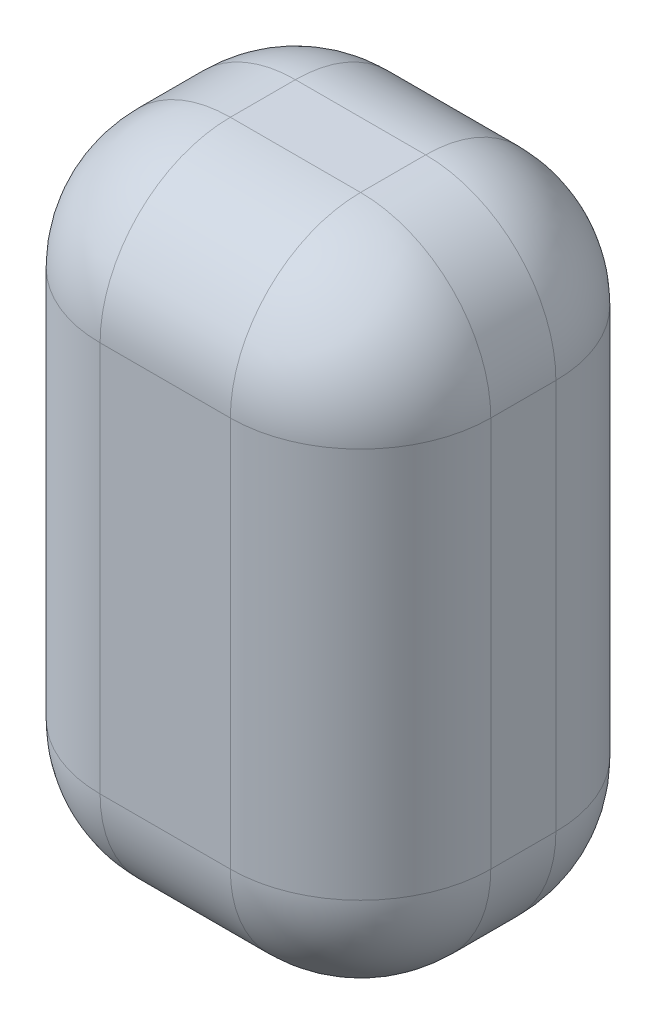
ISO-10303-21;
HEADER;
FILE_DESCRIPTION(('STEP AP214'),'2;1');
FILE_NAME('part.step','',(''),(''),'','','');
FILE_SCHEMA(('AUTOMOTIVE_DESIGN { 1 0 10303 214 1 1 1 1 }'));
ENDSEC;
DATA;
#1=APPLICATION_CONTEXT('core data for automotive mechanical design processes');
#2=APPLICATION_PROTOCOL_DEFINITION('international standard','automotive_design',2000,#1);
#3=PRODUCT_CONTEXT('',#1,'mechanical');
#4=PRODUCT('Part','Part','',(#3));
#5=PRODUCT_RELATED_PRODUCT_CATEGORY('part','',(#4));
#6=PRODUCT_DEFINITION_FORMATION('','',#4);
#7=PRODUCT_DEFINITION_CONTEXT('part definition',#1,'design');
#8=PRODUCT_DEFINITION('design','',#6,#7);
#9=PRODUCT_DEFINITION_SHAPE('','',#8);
#10=(LENGTH_UNIT() NAMED_UNIT(*) SI_UNIT(.MILLI.,.METRE.));
#11=(NAMED_UNIT(*) PLANE_ANGLE_UNIT() SI_UNIT($,.RADIAN.));
#12=(NAMED_UNIT(*) SI_UNIT($,.STERADIAN.) SOLID_ANGLE_UNIT());
#13=UNCERTAINTY_MEASURE_WITH_UNIT(LENGTH_MEASURE(1.E-05),#10,'distance_accuracy_value','');
#14=(GEOMETRIC_REPRESENTATION_CONTEXT(3) GLOBAL_UNCERTAINTY_ASSIGNED_CONTEXT((#13)) GLOBAL_UNIT_ASSIGNED_CONTEXT((#10,
#11,#12)) REPRESENTATION_CONTEXT('',''));
#15=CARTESIAN_POINT('',(0.,0.,0.));
#16=DIRECTION('',(0.,0.,1.));
#17=DIRECTION('',(1.,0.,0.));
#18=AXIS2_PLACEMENT_3D('',#15,#16,#17);
#19=CARTESIAN_POINT('',(30.,100.,-25.));
#20=DIRECTION('',(-1.,0.,0.));
#21=DIRECTION('',(0.,0.,1.));
#22=AXIS2_PLACEMENT_3D('',#19,#20,#21);
#23=PLANE('',#22);
#24=DIRECTION('',(0.,0.,-1.));
#25=VECTOR('',#24,1.);
#26=CARTESIAN_POINT('',(30.,80.,25.));
#27=LINE('',#26,#25);
#28=CARTESIAN_POINT('',(30.,80.,-5.00000000000001));
#29=VERTEX_POINT('',#28);
#30=CARTESIAN_POINT('',(30.,80.,4.99999999999999));
#31=VERTEX_POINT('',#30);
#32=EDGE_CURVE('E189',#29,#31,#27,.F.);
#33=ORIENTED_EDGE('',*,*,#32,.T.);
#34=DIRECTION('',(0.,-1.,0.));
#35=VECTOR('',#34,1.);
#36=CARTESIAN_POINT('',(30.,100.,4.99999999999999));
#37=LINE('',#36,#35);
#38=CARTESIAN_POINT('',(30.,20.,4.99999999999999));
#39=VERTEX_POINT('',#38);
#40=EDGE_CURVE('E191',#31,#39,#37,.T.);
#41=ORIENTED_EDGE('',*,*,#40,.T.);
#42=DIRECTION('',(0.,0.,-1.));
#43=VECTOR('',#42,1.);
#44=CARTESIAN_POINT('',(30.,20.,-25.));
#45=LINE('',#44,#43);
#46=CARTESIAN_POINT('',(30.,20.,-5.00000000000001));
#47=VERTEX_POINT('',#46);
#48=EDGE_CURVE('E187',#39,#47,#45,.T.);
#49=ORIENTED_EDGE('',*,*,#48,.T.);
#50=DIRECTION('',(0.,-1.,0.));
#51=VECTOR('',#50,1.);
#52=CARTESIAN_POINT('',(30.,100.,-5.00000000000001));
#53=LINE('',#52,#51);
#54=EDGE_CURVE('E185',#47,#29,#53,.F.);
#55=ORIENTED_EDGE('',*,*,#54,.T.);
#56=EDGE_LOOP('',(#33,#41,#49,#55));
#57=FACE_BOUND('',#56,.T.);
#58=ADVANCED_FACE('F33',(#57),#23,.F.);
#59=CARTESIAN_POINT('',(-30.,100.,-25.));
#60=DIRECTION('',(0.,0.,1.));
#61=DIRECTION('',(1.,0.,0.));
#62=AXIS2_PLACEMENT_3D('',#59,#60,#61);
#63=PLANE('',#62);
#64=DIRECTION('',(-1.,0.,0.));
#65=VECTOR('',#64,1.);
#66=CARTESIAN_POINT('',(30.,80.,-25.));
#67=LINE('',#66,#65);
#68=CARTESIAN_POINT('',(-10.,80.,-25.));
#69=VERTEX_POINT('',#68);
#70=CARTESIAN_POINT('',(9.99999999999999,80.,-25.));
#71=VERTEX_POINT('',#70);
#72=EDGE_CURVE('E42',#69,#71,#67,.F.);
#73=ORIENTED_EDGE('',*,*,#72,.T.);
#74=DIRECTION('',(0.,-1.,0.));
#75=VECTOR('',#74,1.);
#76=CARTESIAN_POINT('',(9.99999999999999,100.,-25.));
#77=LINE('',#76,#75);
#78=CARTESIAN_POINT('',(9.99999999999999,20.,-25.));
#79=VERTEX_POINT('',#78);
#80=EDGE_CURVE('E11',#71,#79,#77,.T.);
#81=ORIENTED_EDGE('',*,*,#80,.T.);
#82=DIRECTION('',(-1.,0.,0.));
#83=VECTOR('',#82,1.);
#84=CARTESIAN_POINT('',(-30.,20.,-25.));
#85=LINE('',#84,#83);
#86=CARTESIAN_POINT('',(-10.,20.,-25.));
#87=VERTEX_POINT('',#86);
#88=EDGE_CURVE('E194',#79,#87,#85,.T.);
#89=ORIENTED_EDGE('',*,*,#88,.T.);
#90=DIRECTION('',(0.,-1.,0.));
#91=VECTOR('',#90,1.);
#92=CARTESIAN_POINT('',(-10.,100.,-25.));
#93=LINE('',#92,#91);
#94=EDGE_CURVE('E53',#87,#69,#93,.F.);
#95=ORIENTED_EDGE('',*,*,#94,.T.);
#96=EDGE_LOOP('',(#73,#81,#89,#95));
#97=FACE_BOUND('',#96,.T.);
#98=ADVANCED_FACE('F317',(#97),#63,.F.);
#99=CARTESIAN_POINT('',(-30.,100.,-25.));
#100=DIRECTION('',(1.,0.,0.));
#101=DIRECTION('',(0.,0.,-1.));
#102=AXIS2_PLACEMENT_3D('',#99,#100,#101);
#103=PLANE('',#102);
#104=DIRECTION('',(0.,-1.,0.));
#105=VECTOR('',#104,1.);
#106=CARTESIAN_POINT('',(-30.,100.,5.));
#107=LINE('',#106,#105);
#108=CARTESIAN_POINT('',(-30.,20.,5.));
#109=VERTEX_POINT('',#108);
#110=CARTESIAN_POINT('',(-30.,80.,5.));
#111=VERTEX_POINT('',#110);
#112=EDGE_CURVE('E180',#109,#111,#107,.F.);
#113=ORIENTED_EDGE('',*,*,#112,.T.);
#114=DIRECTION('',(0.,0.,1.));
#115=VECTOR('',#114,1.);
#116=CARTESIAN_POINT('',(-30.,80.,-25.));
#117=LINE('',#116,#115);
#118=CARTESIAN_POINT('',(-30.,80.,-5.));
#119=VERTEX_POINT('',#118);
#120=EDGE_CURVE('E182',#111,#119,#117,.F.);
#121=ORIENTED_EDGE('',*,*,#120,.T.);
#122=DIRECTION('',(0.,-1.,0.));
#123=VECTOR('',#122,1.);
#124=CARTESIAN_POINT('',(-30.,100.,-5.));
#125=LINE('',#124,#123);
#126=CARTESIAN_POINT('',(-30.,20.,-5.));
#127=VERTEX_POINT('',#126);
#128=EDGE_CURVE('E176',#119,#127,#125,.T.);
#129=ORIENTED_EDGE('',*,*,#128,.T.);
#130=DIRECTION('',(0.,0.,1.));
#131=VECTOR('',#130,1.);
#132=CARTESIAN_POINT('',(-30.,20.,-25.));
#133=LINE('',#132,#131);
#134=EDGE_CURVE('E178',#127,#109,#133,.T.);
#135=ORIENTED_EDGE('',*,*,#134,.T.);
#136=EDGE_LOOP('',(#113,#121,#129,#135));
#137=FACE_BOUND('',#136,.T.);
#138=ADVANCED_FACE('F268',(#137),#103,.F.);
#139=CARTESIAN_POINT('',(-30.,100.,25.));
#140=DIRECTION('',(0.,0.,-1.));
#141=DIRECTION('',(-1.,0.,0.));
#142=AXIS2_PLACEMENT_3D('',#139,#140,#141);
#143=PLANE('',#142);
#144=DIRECTION('',(1.,0.,0.));
#145=VECTOR('',#144,1.);
#146=CARTESIAN_POINT('',(-30.,80.,25.));
#147=LINE('',#146,#145);
#148=CARTESIAN_POINT('',(9.99999999999999,80.,25.));
#149=VERTEX_POINT('',#148);
#150=CARTESIAN_POINT('',(-10.,80.,25.));
#151=VERTEX_POINT('',#150);
#152=EDGE_CURVE('E150',#149,#151,#147,.F.);
#153=ORIENTED_EDGE('',*,*,#152,.T.);
#154=DIRECTION('',(0.,-1.,0.));
#155=VECTOR('',#154,1.);
#156=CARTESIAN_POINT('',(-10.,100.,25.));
#157=LINE('',#156,#155);
#158=CARTESIAN_POINT('',(-10.,20.,25.));
#159=VERTEX_POINT('',#158);
#160=EDGE_CURVE('E154',#151,#159,#157,.T.);
#161=ORIENTED_EDGE('',*,*,#160,.T.);
#162=DIRECTION('',(1.,0.,0.));
#163=VECTOR('',#162,1.);
#164=CARTESIAN_POINT('',(-30.,20.,25.));
#165=LINE('',#164,#163);
#166=CARTESIAN_POINT('',(9.99999999999999,20.,25.));
#167=VERTEX_POINT('',#166);
#168=EDGE_CURVE('E126',#159,#167,#165,.T.);
#169=ORIENTED_EDGE('',*,*,#168,.T.);
#170=DIRECTION('',(0.,-1.,0.));
#171=VECTOR('',#170,1.);
#172=CARTESIAN_POINT('',(9.99999999999999,100.,25.));
#173=LINE('',#172,#171);
#174=EDGE_CURVE('E144',#167,#149,#173,.F.);
#175=ORIENTED_EDGE('',*,*,#174,.T.);
#176=EDGE_LOOP('',(#153,#161,#169,#175));
#177=FACE_BOUND('',#176,.T.);
#178=ADVANCED_FACE('F152',(#177),#143,.F.);
#179=CARTESIAN_POINT('',(0.,100.,0.));
#180=DIRECTION('',(0.,1.,0.));
#181=DIRECTION('',(0.,0.,1.));
#182=AXIS2_PLACEMENT_3D('',#179,#180,#181);
#183=PLANE('',#182);
#184=DIRECTION('',(0.,0.,1.));
#185=VECTOR('',#184,1.);
#186=CARTESIAN_POINT('',(-10.,100.,25.));
#187=LINE('',#186,#185);
#188=CARTESIAN_POINT('',(-10.,100.,-5.));
#189=VERTEX_POINT('',#188);
#190=CARTESIAN_POINT('',(-10.,100.,5.));
#191=VERTEX_POINT('',#190);
#192=EDGE_CURVE('E171',#189,#191,#187,.T.);
#193=ORIENTED_EDGE('',*,*,#192,.T.);
#194=DIRECTION('',(1.,0.,0.));
#195=VECTOR('',#194,1.);
#196=CARTESIAN_POINT('',(30.,100.,5.));
#197=LINE('',#196,#195);
#198=CARTESIAN_POINT('',(9.99999999999999,100.,5.));
#199=VERTEX_POINT('',#198);
#200=EDGE_CURVE('E173',#191,#199,#197,.T.);
#201=ORIENTED_EDGE('',*,*,#200,.T.);
#202=DIRECTION('',(0.,0.,-1.));
#203=VECTOR('',#202,1.);
#204=CARTESIAN_POINT('',(9.99999999999999,100.,-25.));
#205=LINE('',#204,#203);
#206=CARTESIAN_POINT('',(9.99999999999999,100.,-5.));
#207=VERTEX_POINT('',#206);
#208=EDGE_CURVE('E169',#199,#207,#205,.T.);
#209=ORIENTED_EDGE('',*,*,#208,.T.);
#210=DIRECTION('',(-1.,0.,0.));
#211=VECTOR('',#210,1.);
#212=CARTESIAN_POINT('',(-30.,100.,-5.));
#213=LINE('',#212,#211);
#214=EDGE_CURVE('E167',#207,#189,#213,.T.);
#215=ORIENTED_EDGE('',*,*,#214,.T.);
#216=EDGE_LOOP('',(#193,#201,#209,#215));
#217=FACE_BOUND('',#216,.T.);
#218=ADVANCED_FACE('F310',(#217),#183,.T.);
#219=CARTESIAN_POINT('',(0.,0.,0.));
#220=DIRECTION('',(0.,1.,0.));
#221=DIRECTION('',(0.,0.,1.));
#222=AXIS2_PLACEMENT_3D('',#219,#220,#221);
#223=PLANE('',#222);
#224=DIRECTION('',(0.,0.,-1.));
#225=VECTOR('',#224,1.);
#226=CARTESIAN_POINT('',(9.99999999999999,0.,0.));
#227=LINE('',#226,#225);
#228=CARTESIAN_POINT('',(9.99999999999999,0.,-5.));
#229=VERTEX_POINT('',#228);
#230=CARTESIAN_POINT('',(9.99999999999999,0.,5.));
#231=VERTEX_POINT('',#230);
#232=EDGE_CURVE('E162',#229,#231,#227,.F.);
#233=ORIENTED_EDGE('',*,*,#232,.T.);
#234=DIRECTION('',(1.,0.,0.));
#235=VECTOR('',#234,1.);
#236=CARTESIAN_POINT('',(0.,0.,5.));
#237=LINE('',#236,#235);
#238=CARTESIAN_POINT('',(-10.,0.,5.));
#239=VERTEX_POINT('',#238);
#240=EDGE_CURVE('E128',#231,#239,#237,.F.);
#241=ORIENTED_EDGE('',*,*,#240,.T.);
#242=DIRECTION('',(0.,0.,1.));
#243=VECTOR('',#242,1.);
#244=CARTESIAN_POINT('',(-10.,0.,0.));
#245=LINE('',#244,#243);
#246=CARTESIAN_POINT('',(-10.,0.,-5.));
#247=VERTEX_POINT('',#246);
#248=EDGE_CURVE('E164',#239,#247,#245,.F.);
#249=ORIENTED_EDGE('',*,*,#248,.T.);
#250=DIRECTION('',(-1.,0.,0.));
#251=VECTOR('',#250,1.);
#252=CARTESIAN_POINT('',(0.,0.,-5.));
#253=LINE('',#252,#251);
#254=EDGE_CURVE('E157',#247,#229,#253,.F.);
#255=ORIENTED_EDGE('',*,*,#254,.T.);
#256=EDGE_LOOP('',(#233,#241,#249,#255));
#257=FACE_BOUND('',#256,.T.);
#258=ADVANCED_FACE('F290',(#257),#223,.F.);
#259=CARTESIAN_POINT('',(0.,80.,-5.));
#260=DIRECTION('',(1.,0.,0.));
#261=DIRECTION('',(0.,0.,-1.));
#262=AXIS2_PLACEMENT_3D('',#259,#260,#261);
#263=CYLINDRICAL_SURFACE('',#262,20.);
#264=CARTESIAN_POINT('',(-10.,80.,-5.));
#265=DIRECTION('',(-1.,0.,0.));
#266=DIRECTION('',(0.,0.,1.));
#267=AXIS2_PLACEMENT_3D('',#264,#265,#266);
#268=CIRCLE('',#267,20.);
#269=EDGE_CURVE('E37',#189,#69,#268,.T.);
#270=ORIENTED_EDGE('',*,*,#269,.F.);
#271=ORIENTED_EDGE('',*,*,#214,.F.);
#272=CARTESIAN_POINT('',(9.99999999999999,80.,-5.));
#273=DIRECTION('',(1.,0.,0.));
#274=DIRECTION('',(0.,1.,0.));
#275=AXIS2_PLACEMENT_3D('',#272,#273,#274);
#276=CIRCLE('',#275,20.);
#277=EDGE_CURVE('E248',#71,#207,#276,.T.);
#278=ORIENTED_EDGE('',*,*,#277,.F.);
#279=ORIENTED_EDGE('',*,*,#72,.F.);
#280=EDGE_LOOP('',(#270,#271,#278,#279));
#281=FACE_BOUND('',#280,.T.);
#282=ADVANCED_FACE('F35',(#281),#263,.T.);
#283=CARTESIAN_POINT('',(-10.,80.,-5.));
#284=DIRECTION('',(0.,0.,1.));
#285=DIRECTION('',(1.,0.,0.));
#286=AXIS2_PLACEMENT_3D('',#283,#284,#285);
#287=SPHERICAL_SURFACE('',#286,20.);
#288=CARTESIAN_POINT('',(-10.,80.,-5.));
#289=DIRECTION('',(0.,0.,-1.));
#290=DIRECTION('',(-1.,0.,0.));
#291=AXIS2_PLACEMENT_3D('',#288,#289,#290);
#292=CIRCLE('',#291,20.);
#293=EDGE_CURVE('E243',#189,#119,#292,.F.);
#294=ORIENTED_EDGE('',*,*,#293,.F.);
#295=ORIENTED_EDGE('',*,*,#269,.T.);
#296=CARTESIAN_POINT('',(-10.,80.,-5.));
#297=DIRECTION('',(0.,1.,0.));
#298=DIRECTION('',(0.,0.,1.));
#299=AXIS2_PLACEMENT_3D('',#296,#297,#298);
#300=CIRCLE('',#299,20.);
#301=EDGE_CURVE('E246',#119,#69,#300,.F.);
#302=ORIENTED_EDGE('',*,*,#301,.F.);
#303=EDGE_LOOP('',(#294,#295,#302));
#304=FACE_BOUND('',#303,.T.);
#305=ADVANCED_FACE('F258',(#304),#287,.T.);
#306=CARTESIAN_POINT('',(9.99999999999999,80.,-5.));
#307=DIRECTION('',(0.,0.,1.));
#308=DIRECTION('',(1.,0.,0.));
#309=AXIS2_PLACEMENT_3D('',#306,#307,#308);
#310=SPHERICAL_SURFACE('',#309,20.);
#311=CARTESIAN_POINT('',(9.99999999999999,80.,-5.));
#312=DIRECTION('',(0.,1.,0.));
#313=DIRECTION('',(0.,0.,1.));
#314=AXIS2_PLACEMENT_3D('',#311,#312,#313);
#315=CIRCLE('',#314,20.);
#316=EDGE_CURVE('E237',#71,#29,#315,.F.);
#317=ORIENTED_EDGE('',*,*,#316,.F.);
#318=ORIENTED_EDGE('',*,*,#277,.T.);
#319=CARTESIAN_POINT('',(9.99999999999999,80.,-5.));
#320=DIRECTION('',(0.,0.,-1.));
#321=DIRECTION('',(-1.,0.,0.));
#322=AXIS2_PLACEMENT_3D('',#319,#320,#321);
#323=CIRCLE('',#322,20.);
#324=EDGE_CURVE('E240',#29,#207,#323,.F.);
#325=ORIENTED_EDGE('',*,*,#324,.F.);
#326=EDGE_LOOP('',(#317,#318,#325));
#327=FACE_BOUND('',#326,.T.);
#328=ADVANCED_FACE('F312',(#327),#310,.T.);
#329=CARTESIAN_POINT('',(-10.,100.,-5.));
#330=DIRECTION('',(0.,-1.,0.));
#331=DIRECTION('',(0.,0.,-1.));
#332=AXIS2_PLACEMENT_3D('',#329,#330,#331);
#333=CYLINDRICAL_SURFACE('',#332,20.);
#334=ORIENTED_EDGE('',*,*,#301,.T.);
#335=ORIENTED_EDGE('',*,*,#94,.F.);
#336=CARTESIAN_POINT('',(-10.,20.,-5.));
#337=DIRECTION('',(0.,-1.,0.));
#338=DIRECTION('',(0.,0.,-1.));
#339=AXIS2_PLACEMENT_3D('',#336,#337,#338);
#340=CIRCLE('',#339,20.);
#341=EDGE_CURVE('E231',#127,#87,#340,.T.);
#342=ORIENTED_EDGE('',*,*,#341,.F.);
#343=ORIENTED_EDGE('',*,*,#128,.F.);
#344=EDGE_LOOP('',(#334,#335,#342,#343));
#345=FACE_BOUND('',#344,.T.);
#346=ADVANCED_FACE('F263',(#345),#333,.T.);
#347=CARTESIAN_POINT('',(-10.,80.,0.));
#348=DIRECTION('',(0.,0.,-1.));
#349=DIRECTION('',(-1.,0.,0.));
#350=AXIS2_PLACEMENT_3D('',#347,#348,#349);
#351=CYLINDRICAL_SURFACE('',#350,20.);
#352=ORIENTED_EDGE('',*,*,#293,.T.);
#353=ORIENTED_EDGE('',*,*,#120,.F.);
#354=CARTESIAN_POINT('',(-10.,80.,5.));
#355=DIRECTION('',(0.,0.,1.));
#356=DIRECTION('',(1.,0.,0.));
#357=AXIS2_PLACEMENT_3D('',#354,#355,#356);
#358=CIRCLE('',#357,20.);
#359=EDGE_CURVE('E228',#191,#111,#358,.T.);
#360=ORIENTED_EDGE('',*,*,#359,.F.);
#361=ORIENTED_EDGE('',*,*,#192,.F.);
#362=EDGE_LOOP('',(#352,#353,#360,#361));
#363=FACE_BOUND('',#362,.T.);
#364=ADVANCED_FACE('F274',(#363),#351,.T.);
#365=CARTESIAN_POINT('',(0.,80.,5.));
#366=DIRECTION('',(-1.,0.,0.));
#367=DIRECTION('',(0.,0.,1.));
#368=AXIS2_PLACEMENT_3D('',#365,#366,#367);
#369=CYLINDRICAL_SURFACE('',#368,20.);
#370=CARTESIAN_POINT('',(9.99999999999999,80.,5.));
#371=DIRECTION('',(1.,0.,0.));
#372=DIRECTION('',(0.,0.,-1.));
#373=AXIS2_PLACEMENT_3D('',#370,#371,#372);
#374=CIRCLE('',#373,20.);
#375=EDGE_CURVE('E222',#199,#149,#374,.T.);
#376=ORIENTED_EDGE('',*,*,#375,.F.);
#377=ORIENTED_EDGE('',*,*,#200,.F.);
#378=CARTESIAN_POINT('',(-10.,80.,5.));
#379=DIRECTION('',(-1.,0.,0.));
#380=DIRECTION('',(0.,0.,1.));
#381=AXIS2_PLACEMENT_3D('',#378,#379,#380);
#382=CIRCLE('',#381,20.);
#383=EDGE_CURVE('E225',#151,#191,#382,.T.);
#384=ORIENTED_EDGE('',*,*,#383,.F.);
#385=ORIENTED_EDGE('',*,*,#152,.F.);
#386=EDGE_LOOP('',(#376,#377,#384,#385));
#387=FACE_BOUND('',#386,.T.);
#388=ADVANCED_FACE('F308',(#387),#369,.T.);
#389=CARTESIAN_POINT('',(9.99999999999999,80.,0.));
#390=DIRECTION('',(0.,0.,1.));
#391=DIRECTION('',(1.,0.,0.));
#392=AXIS2_PLACEMENT_3D('',#389,#390,#391);
#393=CYLINDRICAL_SURFACE('',#392,20.);
#394=ORIENTED_EDGE('',*,*,#324,.T.);
#395=ORIENTED_EDGE('',*,*,#208,.F.);
#396=CARTESIAN_POINT('',(9.99999999999999,80.,5.));
#397=DIRECTION('',(0.,0.,1.));
#398=DIRECTION('',(1.,0.,0.));
#399=AXIS2_PLACEMENT_3D('',#396,#397,#398);
#400=CIRCLE('',#399,20.);
#401=EDGE_CURVE('E220',#31,#199,#400,.T.);
#402=ORIENTED_EDGE('',*,*,#401,.F.);
#403=ORIENTED_EDGE('',*,*,#32,.F.);
#404=EDGE_LOOP('',(#394,#395,#402,#403));
#405=FACE_BOUND('',#404,.T.);
#406=ADVANCED_FACE('F302',(#405),#393,.T.);
#407=CARTESIAN_POINT('',(9.99999999999999,100.,-5.));
#408=DIRECTION('',(0.,-1.,0.));
#409=DIRECTION('',(0.,0.,-1.));
#410=AXIS2_PLACEMENT_3D('',#407,#408,#409);
#411=CYLINDRICAL_SURFACE('',#410,20.);
#412=ORIENTED_EDGE('',*,*,#316,.T.);
#413=ORIENTED_EDGE('',*,*,#54,.F.);
#414=CARTESIAN_POINT('',(9.99999999999999,20.,-5.));
#415=DIRECTION('',(0.,-1.,0.));
#416=DIRECTION('',(0.,0.,-1.));
#417=AXIS2_PLACEMENT_3D('',#414,#415,#416);
#418=CIRCLE('',#417,20.);
#419=EDGE_CURVE('E217',#79,#47,#418,.T.);
#420=ORIENTED_EDGE('',*,*,#419,.F.);
#421=ORIENTED_EDGE('',*,*,#80,.F.);
#422=EDGE_LOOP('',(#412,#413,#420,#421));
#423=FACE_BOUND('',#422,.T.);
#424=ADVANCED_FACE('F315',(#423),#411,.T.);
#425=CARTESIAN_POINT('',(-30.,20.,-5.));
#426=DIRECTION('',(-1.,0.,0.));
#427=DIRECTION('',(0.,0.,1.));
#428=AXIS2_PLACEMENT_3D('',#425,#426,#427);
#429=CYLINDRICAL_SURFACE('',#428,20.);
#430=CARTESIAN_POINT('',(-10.,20.,-5.));
#431=DIRECTION('',(-1.,0.,0.));
#432=DIRECTION('',(0.,0.,1.));
#433=AXIS2_PLACEMENT_3D('',#430,#431,#432);
#434=CIRCLE('',#433,20.);
#435=EDGE_CURVE('E234',#87,#247,#434,.T.);
#436=ORIENTED_EDGE('',*,*,#435,.F.);
#437=ORIENTED_EDGE('',*,*,#88,.F.);
#438=CARTESIAN_POINT('',(9.99999999999999,20.,-5.));
#439=DIRECTION('',(1.,0.,0.));
#440=DIRECTION('',(0.,0.,-1.));
#441=AXIS2_PLACEMENT_3D('',#438,#439,#440);
#442=CIRCLE('',#441,20.);
#443=EDGE_CURVE('E215',#229,#79,#442,.T.);
#444=ORIENTED_EDGE('',*,*,#443,.F.);
#445=ORIENTED_EDGE('',*,*,#254,.F.);
#446=EDGE_LOOP('',(#436,#437,#444,#445));
#447=FACE_BOUND('',#446,.T.);
#448=ADVANCED_FACE('F319',(#447),#429,.T.);
#449=CARTESIAN_POINT('',(-10.,20.,-5.));
#450=DIRECTION('',(0.,0.,1.));
#451=DIRECTION('',(1.,0.,0.));
#452=AXIS2_PLACEMENT_3D('',#449,#450,#451);
#453=SPHERICAL_SURFACE('',#452,20.);
#454=ORIENTED_EDGE('',*,*,#341,.T.);
#455=ORIENTED_EDGE('',*,*,#435,.T.);
#456=CARTESIAN_POINT('',(-10.,20.,-5.));
#457=DIRECTION('',(0.,0.,-1.));
#458=DIRECTION('',(-1.,0.,0.));
#459=AXIS2_PLACEMENT_3D('',#456,#457,#458);
#460=CIRCLE('',#459,20.);
#461=EDGE_CURVE('E212',#127,#247,#460,.F.);
#462=ORIENTED_EDGE('',*,*,#461,.F.);
#463=EDGE_LOOP('',(#454,#455,#462));
#464=FACE_BOUND('',#463,.T.);
#465=ADVANCED_FACE('F321',(#464),#453,.T.);
#466=CARTESIAN_POINT('',(-10.,80.,5.));
#467=DIRECTION('',(0.,0.,1.));
#468=DIRECTION('',(1.,0.,0.));
#469=AXIS2_PLACEMENT_3D('',#466,#467,#468);
#470=SPHERICAL_SURFACE('',#469,20.);
#471=ORIENTED_EDGE('',*,*,#383,.T.);
#472=ORIENTED_EDGE('',*,*,#359,.T.);
#473=CARTESIAN_POINT('',(-10.,80.,5.));
#474=DIRECTION('',(0.,1.,0.));
#475=DIRECTION('',(0.,0.,1.));
#476=AXIS2_PLACEMENT_3D('',#473,#474,#475);
#477=CIRCLE('',#476,20.);
#478=EDGE_CURVE('E209',#151,#111,#477,.F.);
#479=ORIENTED_EDGE('',*,*,#478,.F.);
#480=EDGE_LOOP('',(#471,#472,#479));
#481=FACE_BOUND('',#480,.T.);
#482=ADVANCED_FACE('F277',(#481),#470,.T.);
#483=CARTESIAN_POINT('',(9.99999999999999,80.,5.));
#484=DIRECTION('',(0.,0.,1.));
#485=DIRECTION('',(1.,0.,0.));
#486=AXIS2_PLACEMENT_3D('',#483,#484,#485);
#487=SPHERICAL_SURFACE('',#486,20.);
#488=ORIENTED_EDGE('',*,*,#401,.T.);
#489=ORIENTED_EDGE('',*,*,#375,.T.);
#490=CARTESIAN_POINT('',(9.99999999999999,80.,5.));
#491=DIRECTION('',(0.,1.,0.));
#492=DIRECTION('',(0.,0.,1.));
#493=AXIS2_PLACEMENT_3D('',#490,#491,#492);
#494=CIRCLE('',#493,20.);
#495=EDGE_CURVE('E147',#31,#149,#494,.F.);
#496=ORIENTED_EDGE('',*,*,#495,.F.);
#497=EDGE_LOOP('',(#488,#489,#496));
#498=FACE_BOUND('',#497,.T.);
#499=ADVANCED_FACE('F305',(#498),#487,.T.);
#500=CARTESIAN_POINT('',(9.99999999999999,20.,-5.));
#501=DIRECTION('',(0.,0.,1.));
#502=DIRECTION('',(1.,0.,0.));
#503=AXIS2_PLACEMENT_3D('',#500,#501,#502);
#504=SPHERICAL_SURFACE('',#503,20.);
#505=ORIENTED_EDGE('',*,*,#443,.T.);
#506=ORIENTED_EDGE('',*,*,#419,.T.);
#507=CARTESIAN_POINT('',(9.99999999999999,20.,-5.));
#508=DIRECTION('',(0.,0.,-1.));
#509=DIRECTION('',(-1.,0.,0.));
#510=AXIS2_PLACEMENT_3D('',#507,#508,#509);
#511=CIRCLE('',#510,20.);
#512=EDGE_CURVE('E205',#229,#47,#511,.F.);
#513=ORIENTED_EDGE('',*,*,#512,.F.);
#514=EDGE_LOOP('',(#505,#506,#513));
#515=FACE_BOUND('',#514,.T.);
#516=ADVANCED_FACE('F352',(#515),#504,.T.);
#517=CARTESIAN_POINT('',(-10.,20.,-25.));
#518=DIRECTION('',(0.,0.,1.));
#519=DIRECTION('',(1.,0.,0.));
#520=AXIS2_PLACEMENT_3D('',#517,#518,#519);
#521=CYLINDRICAL_SURFACE('',#520,20.);
#522=ORIENTED_EDGE('',*,*,#461,.T.);
#523=ORIENTED_EDGE('',*,*,#248,.F.);
#524=CARTESIAN_POINT('',(-10.,20.,5.));
#525=DIRECTION('',(0.,0.,1.));
#526=DIRECTION('',(1.,0.,0.));
#527=AXIS2_PLACEMENT_3D('',#524,#525,#526);
#528=CIRCLE('',#527,20.);
#529=EDGE_CURVE('E202',#109,#239,#528,.T.);
#530=ORIENTED_EDGE('',*,*,#529,.F.);
#531=ORIENTED_EDGE('',*,*,#134,.F.);
#532=EDGE_LOOP('',(#522,#523,#530,#531));
#533=FACE_BOUND('',#532,.T.);
#534=ADVANCED_FACE('F287',(#533),#521,.T.);
#535=CARTESIAN_POINT('',(-10.,100.,5.));
#536=DIRECTION('',(0.,-1.,0.));
#537=DIRECTION('',(0.,0.,-1.));
#538=AXIS2_PLACEMENT_3D('',#535,#536,#537);
#539=CYLINDRICAL_SURFACE('',#538,20.);
#540=ORIENTED_EDGE('',*,*,#478,.T.);
#541=ORIENTED_EDGE('',*,*,#112,.F.);
#542=CARTESIAN_POINT('',(-10.,20.,5.));
#543=DIRECTION('',(0.,-1.,0.));
#544=DIRECTION('',(0.,0.,-1.));
#545=AXIS2_PLACEMENT_3D('',#542,#543,#544);
#546=CIRCLE('',#545,20.);
#547=EDGE_CURVE('E141',#159,#109,#546,.T.);
#548=ORIENTED_EDGE('',*,*,#547,.F.);
#549=ORIENTED_EDGE('',*,*,#160,.F.);
#550=EDGE_LOOP('',(#540,#541,#548,#549));
#551=FACE_BOUND('',#550,.T.);
#552=ADVANCED_FACE('F280',(#551),#539,.T.);
#553=CARTESIAN_POINT('',(9.99999999999999,100.,5.));
#554=DIRECTION('',(0.,-1.,0.));
#555=DIRECTION('',(0.,0.,-1.));
#556=AXIS2_PLACEMENT_3D('',#553,#554,#555);
#557=CYLINDRICAL_SURFACE('',#556,20.);
#558=ORIENTED_EDGE('',*,*,#495,.T.);
#559=ORIENTED_EDGE('',*,*,#174,.F.);
#560=CARTESIAN_POINT('',(9.99999999999999,20.,5.));
#561=DIRECTION('',(0.,-1.,0.));
#562=DIRECTION('',(0.,0.,-1.));
#563=AXIS2_PLACEMENT_3D('',#560,#561,#562);
#564=CIRCLE('',#563,20.);
#565=EDGE_CURVE('E133',#39,#167,#564,.T.);
#566=ORIENTED_EDGE('',*,*,#565,.F.);
#567=ORIENTED_EDGE('',*,*,#40,.F.);
#568=EDGE_LOOP('',(#558,#559,#566,#567));
#569=FACE_BOUND('',#568,.T.);
#570=ADVANCED_FACE('F145',(#569),#557,.T.);
#571=CARTESIAN_POINT('',(9.99999999999999,20.,-25.));
#572=DIRECTION('',(0.,0.,-1.));
#573=DIRECTION('',(-1.,0.,0.));
#574=AXIS2_PLACEMENT_3D('',#571,#572,#573);
#575=CYLINDRICAL_SURFACE('',#574,20.);
#576=ORIENTED_EDGE('',*,*,#512,.T.);
#577=ORIENTED_EDGE('',*,*,#48,.F.);
#578=CARTESIAN_POINT('',(9.99999999999999,20.,5.));
#579=DIRECTION('',(0.,0.,1.));
#580=DIRECTION('',(1.,0.,0.));
#581=AXIS2_PLACEMENT_3D('',#578,#579,#580);
#582=CIRCLE('',#581,20.);
#583=EDGE_CURVE('E137',#231,#39,#582,.T.);
#584=ORIENTED_EDGE('',*,*,#583,.F.);
#585=ORIENTED_EDGE('',*,*,#232,.F.);
#586=EDGE_LOOP('',(#576,#577,#584,#585));
#587=FACE_BOUND('',#586,.T.);
#588=ADVANCED_FACE('F294',(#587),#575,.T.);
#589=CARTESIAN_POINT('',(-10.,20.,5.));
#590=DIRECTION('',(0.,0.,1.));
#591=DIRECTION('',(1.,0.,0.));
#592=AXIS2_PLACEMENT_3D('',#589,#590,#591);
#593=SPHERICAL_SURFACE('',#592,20.);
#594=ORIENTED_EDGE('',*,*,#547,.T.);
#595=ORIENTED_EDGE('',*,*,#529,.T.);
#596=CARTESIAN_POINT('',(-10.,20.,5.));
#597=DIRECTION('',(-1.,0.,0.));
#598=DIRECTION('',(0.,0.,1.));
#599=AXIS2_PLACEMENT_3D('',#596,#597,#598);
#600=CIRCLE('',#599,20.);
#601=EDGE_CURVE('E130',#159,#239,#600,.F.);
#602=ORIENTED_EDGE('',*,*,#601,.F.);
#603=EDGE_LOOP('',(#594,#595,#602));
#604=FACE_BOUND('',#603,.T.);
#605=ADVANCED_FACE('F284',(#604),#593,.T.);
#606=CARTESIAN_POINT('',(9.99999999999999,20.,5.));
#607=DIRECTION('',(0.,0.,1.));
#608=DIRECTION('',(1.,0.,0.));
#609=AXIS2_PLACEMENT_3D('',#606,#607,#608);
#610=SPHERICAL_SURFACE('',#609,20.);
#611=ORIENTED_EDGE('',*,*,#583,.T.);
#612=ORIENTED_EDGE('',*,*,#565,.T.);
#613=CARTESIAN_POINT('',(9.99999999999999,20.,5.));
#614=DIRECTION('',(1.,0.,0.));
#615=DIRECTION('',(0.,0.,-1.));
#616=AXIS2_PLACEMENT_3D('',#613,#614,#615);
#617=CIRCLE('',#616,20.);
#618=EDGE_CURVE('E122',#231,#167,#617,.F.);
#619=ORIENTED_EDGE('',*,*,#618,.F.);
#620=EDGE_LOOP('',(#611,#612,#619));
#621=FACE_BOUND('',#620,.T.);
#622=ADVANCED_FACE('F135',(#621),#610,.T.);
#623=CARTESIAN_POINT('',(-30.,20.,5.));
#624=DIRECTION('',(1.,0.,0.));
#625=DIRECTION('',(0.,0.,-1.));
#626=AXIS2_PLACEMENT_3D('',#623,#624,#625);
#627=CYLINDRICAL_SURFACE('',#626,20.);
#628=ORIENTED_EDGE('',*,*,#601,.T.);
#629=ORIENTED_EDGE('',*,*,#240,.F.);
#630=ORIENTED_EDGE('',*,*,#618,.T.);
#631=ORIENTED_EDGE('',*,*,#168,.F.);
#632=EDGE_LOOP('',(#628,#629,#630,#631));
#633=FACE_BOUND('',#632,.T.);
#634=ADVANCED_FACE('F124',(#633),#627,.T.);
#635=CLOSED_SHELL('',(#58,#98,#138,#178,#218,#258,#282,#305,#328,#346,#364,#388,#406,#424,#448,
#465,#482,#499,#516,#534,#552,#570,#588,#605,#622,#634));
#636=MANIFOLD_SOLID_BREP('B2',#635);
#637=ADVANCED_BREP_SHAPE_REPRESENTATION('',(#18,#636),#14);
#638=SHAPE_DEFINITION_REPRESENTATION(#9,#637);
ENDSEC;
END-ISO-10303-21;
